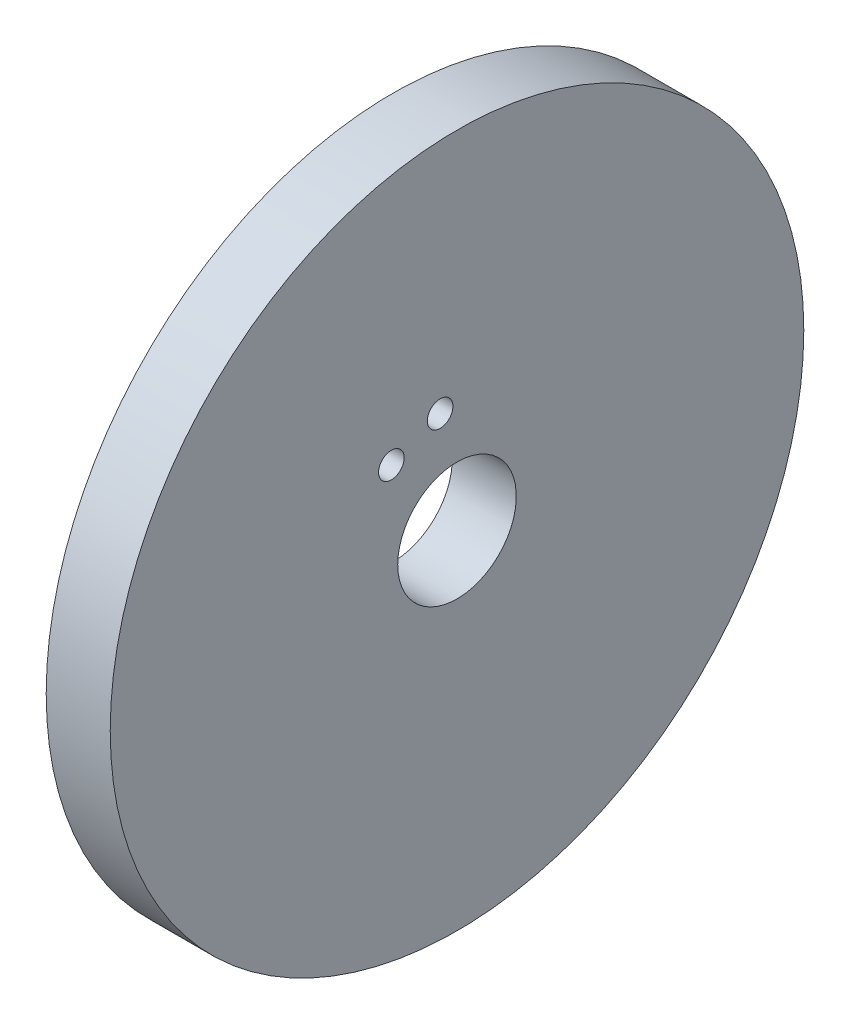
ISO-10303-21;
HEADER;
FILE_DESCRIPTION(('STEP AP214'),'2;1');
FILE_NAME('part.step','',(''),(''),'','','');
FILE_SCHEMA(('AUTOMOTIVE_DESIGN { 1 0 10303 214 1 1 1 1 }'));
ENDSEC;
DATA;
#1=APPLICATION_CONTEXT('core data for automotive mechanical design processes');
#2=APPLICATION_PROTOCOL_DEFINITION('international standard','automotive_design',2000,#1);
#3=PRODUCT_CONTEXT('',#1,'mechanical');
#4=PRODUCT('Part','Part','',(#3));
#5=PRODUCT_RELATED_PRODUCT_CATEGORY('part','',(#4));
#6=PRODUCT_DEFINITION_FORMATION('','',#4);
#7=PRODUCT_DEFINITION_CONTEXT('part definition',#1,'design');
#8=PRODUCT_DEFINITION('design','',#6,#7);
#9=PRODUCT_DEFINITION_SHAPE('','',#8);
#10=(LENGTH_UNIT() NAMED_UNIT(*) SI_UNIT(.MILLI.,.METRE.));
#11=(NAMED_UNIT(*) PLANE_ANGLE_UNIT() SI_UNIT($,.RADIAN.));
#12=(NAMED_UNIT(*) SI_UNIT($,.STERADIAN.) SOLID_ANGLE_UNIT());
#13=UNCERTAINTY_MEASURE_WITH_UNIT(LENGTH_MEASURE(1.E-05),#10,'distance_accuracy_value','');
#14=(GEOMETRIC_REPRESENTATION_CONTEXT(3) GLOBAL_UNCERTAINTY_ASSIGNED_CONTEXT((#13)) GLOBAL_UNIT_ASSIGNED_CONTEXT((#10,
#11,#12)) REPRESENTATION_CONTEXT('',''));
#15=CARTESIAN_POINT('',(0.,0.,0.));
#16=DIRECTION('',(0.,0.,1.));
#17=DIRECTION('',(1.,0.,0.));
#18=AXIS2_PLACEMENT_3D('',#15,#16,#17);
#19=CARTESIAN_POINT('',(13.7,65.,0.));
#20=DIRECTION('',(1.,0.,0.));
#21=DIRECTION('',(0.,0.,-1.));
#22=AXIS2_PLACEMENT_3D('',#19,#20,#21);
#23=PLANE('',#22);
#24=CARTESIAN_POINT('',(13.7,20.5579739264658,3.16381226351266));
#25=DIRECTION('',(1.,0.,0.));
#26=DIRECTION('',(0.,0.,-1.));
#27=AXIS2_PLACEMENT_3D('',#24,#25,#26);
#28=CIRCLE('',#27,2.4);
#29=CARTESIAN_POINT('',(13.7,20.5579739264658,0.763812263512656));
#30=VERTEX_POINT('',#29);
#31=EDGE_CURVE('E50',#30,#30,#28,.F.);
#32=ORIENTED_EDGE('',*,*,#31,.F.);
#33=EDGE_LOOP('',(#32));
#34=FACE_BOUND('',#33,.T.);
#35=CARTESIAN_POINT('',(13.7,16.7738358767911,12.2995296649292));
#36=DIRECTION('',(1.,0.,0.));
#37=DIRECTION('',(0.,0.,-1.));
#38=AXIS2_PLACEMENT_3D('',#35,#36,#37);
#39=CIRCLE('',#38,2.4);
#40=CARTESIAN_POINT('',(13.7,16.7738358767911,9.89952966492923));
#41=VERTEX_POINT('',#40);
#42=EDGE_CURVE('E53',#41,#41,#39,.F.);
#43=ORIENTED_EDGE('',*,*,#42,.F.);
#44=EDGE_LOOP('',(#43));
#45=FACE_BOUND('',#44,.T.);
#46=CARTESIAN_POINT('',(13.7,0.,0.));
#47=DIRECTION('',(-1.,0.,0.));
#48=DIRECTION('',(0.,0.,1.));
#49=AXIS2_PLACEMENT_3D('',#46,#47,#48);
#50=CIRCLE('',#49,11.1125);
#51=CARTESIAN_POINT('',(13.7,0.,11.1125));
#52=VERTEX_POINT('',#51);
#53=EDGE_CURVE('E10',#52,#52,#50,.T.);
#54=ORIENTED_EDGE('',*,*,#53,.F.);
#55=EDGE_LOOP('',(#54));
#56=FACE_BOUND('',#55,.T.);
#57=CARTESIAN_POINT('',(13.7,0.,0.));
#58=DIRECTION('',(-1.,0.,0.));
#59=DIRECTION('',(0.,0.,1.));
#60=AXIS2_PLACEMENT_3D('',#57,#58,#59);
#61=CIRCLE('',#60,65.);
#62=CARTESIAN_POINT('',(13.7,0.,65.));
#63=VERTEX_POINT('',#62);
#64=EDGE_CURVE('E45',#63,#63,#61,.T.);
#65=ORIENTED_EDGE('',*,*,#64,.T.);
#66=EDGE_LOOP('',(#65));
#67=FACE_BOUND('',#66,.T.);
#68=ADVANCED_FACE('F31',(#34,#45,#56,#67),#23,.F.);
#69=CARTESIAN_POINT('',(-110.,0.,0.));
#70=DIRECTION('',(-1.,0.,0.));
#71=DIRECTION('',(0.,0.,1.));
#72=AXIS2_PLACEMENT_3D('',#69,#70,#71);
#73=CYLINDRICAL_SURFACE('',#72,11.1125);
#74=CARTESIAN_POINT('',(25.7,0.,0.));
#75=DIRECTION('',(-1.,0.,0.));
#76=DIRECTION('',(0.,0.,1.));
#77=AXIS2_PLACEMENT_3D('',#74,#75,#76);
#78=CIRCLE('',#77,11.1125);
#79=CARTESIAN_POINT('',(25.7,0.,11.1125));
#80=VERTEX_POINT('',#79);
#81=EDGE_CURVE('E37',#80,#80,#78,.T.);
#82=ORIENTED_EDGE('',*,*,#81,.F.);
#83=EDGE_LOOP('',(#82));
#84=FACE_BOUND('',#83,.T.);
#85=ORIENTED_EDGE('',*,*,#53,.T.);
#86=EDGE_LOOP('',(#85));
#87=FACE_BOUND('',#86,.T.);
#88=ADVANCED_FACE('F70',(#84,#87),#73,.F.);
#89=CARTESIAN_POINT('',(25.7,11.1125,0.));
#90=DIRECTION('',(-1.,0.,0.));
#91=DIRECTION('',(0.,0.,1.));
#92=AXIS2_PLACEMENT_3D('',#89,#90,#91);
#93=PLANE('',#92);
#94=CARTESIAN_POINT('',(25.7,20.5579739264658,3.16381226351266));
#95=DIRECTION('',(1.,0.,0.));
#96=DIRECTION('',(0.,0.,-1.));
#97=AXIS2_PLACEMENT_3D('',#94,#95,#96);
#98=CIRCLE('',#97,2.4);
#99=CARTESIAN_POINT('',(25.7,20.5579739264658,0.763812263512656));
#100=VERTEX_POINT('',#99);
#101=EDGE_CURVE('E56',#100,#100,#98,.T.);
#102=ORIENTED_EDGE('',*,*,#101,.F.);
#103=EDGE_LOOP('',(#102));
#104=FACE_BOUND('',#103,.T.);
#105=CARTESIAN_POINT('',(25.7,16.7738358767911,12.2995296649292));
#106=DIRECTION('',(1.,0.,0.));
#107=DIRECTION('',(0.,0.,-1.));
#108=AXIS2_PLACEMENT_3D('',#105,#106,#107);
#109=CIRCLE('',#108,2.4);
#110=CARTESIAN_POINT('',(25.7,16.7738358767911,9.89952966492923));
#111=VERTEX_POINT('',#110);
#112=EDGE_CURVE('E57',#111,#111,#109,.T.);
#113=ORIENTED_EDGE('',*,*,#112,.F.);
#114=EDGE_LOOP('',(#113));
#115=FACE_BOUND('',#114,.T.);
#116=CARTESIAN_POINT('',(25.7,0.,0.));
#117=DIRECTION('',(-1.,0.,0.));
#118=DIRECTION('',(0.,0.,1.));
#119=AXIS2_PLACEMENT_3D('',#116,#117,#118);
#120=CIRCLE('',#119,65.);
#121=CARTESIAN_POINT('',(25.7,0.,65.));
#122=VERTEX_POINT('',#121);
#123=EDGE_CURVE('E41',#122,#122,#120,.T.);
#124=ORIENTED_EDGE('',*,*,#123,.F.);
#125=EDGE_LOOP('',(#124));
#126=FACE_BOUND('',#125,.T.);
#127=ORIENTED_EDGE('',*,*,#81,.T.);
#128=EDGE_LOOP('',(#127));
#129=FACE_BOUND('',#128,.T.);
#130=ADVANCED_FACE('F66',(#104,#115,#126,#129),#93,.F.);
#131=CARTESIAN_POINT('',(-110.,0.,0.));
#132=DIRECTION('',(-1.,0.,0.));
#133=DIRECTION('',(0.,0.,1.));
#134=AXIS2_PLACEMENT_3D('',#131,#132,#133);
#135=CYLINDRICAL_SURFACE('',#134,65.);
#136=ORIENTED_EDGE('',*,*,#64,.F.);
#137=EDGE_LOOP('',(#136));
#138=FACE_BOUND('',#137,.T.);
#139=ORIENTED_EDGE('',*,*,#123,.T.);
#140=EDGE_LOOP('',(#139));
#141=FACE_BOUND('',#140,.T.);
#142=ADVANCED_FACE('F69',(#138,#141),#135,.T.);
#143=CARTESIAN_POINT('',(25.7,16.7738358767911,12.2995296649292));
#144=DIRECTION('',(-1.,0.,0.));
#145=DIRECTION('',(0.,0.,1.));
#146=AXIS2_PLACEMENT_3D('',#143,#144,#145);
#147=CYLINDRICAL_SURFACE('',#146,2.4);
#148=ORIENTED_EDGE('',*,*,#112,.T.);
#149=EDGE_LOOP('',(#148));
#150=FACE_BOUND('',#149,.T.);
#151=ORIENTED_EDGE('',*,*,#42,.T.);
#152=EDGE_LOOP('',(#151));
#153=FACE_BOUND('',#152,.T.);
#154=ADVANCED_FACE('F77',(#150,#153),#147,.F.);
#155=CARTESIAN_POINT('',(25.7,20.5579739264658,3.16381226351266));
#156=DIRECTION('',(-1.,0.,0.));
#157=DIRECTION('',(0.,0.,1.));
#158=AXIS2_PLACEMENT_3D('',#155,#156,#157);
#159=CYLINDRICAL_SURFACE('',#158,2.4);
#160=ORIENTED_EDGE('',*,*,#101,.T.);
#161=EDGE_LOOP('',(#160));
#162=FACE_BOUND('',#161,.T.);
#163=ORIENTED_EDGE('',*,*,#31,.T.);
#164=EDGE_LOOP('',(#163));
#165=FACE_BOUND('',#164,.T.);
#166=ADVANCED_FACE('F63',(#162,#165),#159,.F.);
#167=CLOSED_SHELL('',(#68,#88,#130,#142,#154,#166));
#168=MANIFOLD_SOLID_BREP('B2',#167);
#169=ADVANCED_BREP_SHAPE_REPRESENTATION('',(#18,#168),#14);
#170=SHAPE_DEFINITION_REPRESENTATION(#9,#169);
ENDSEC;
END-ISO-10303-21;
